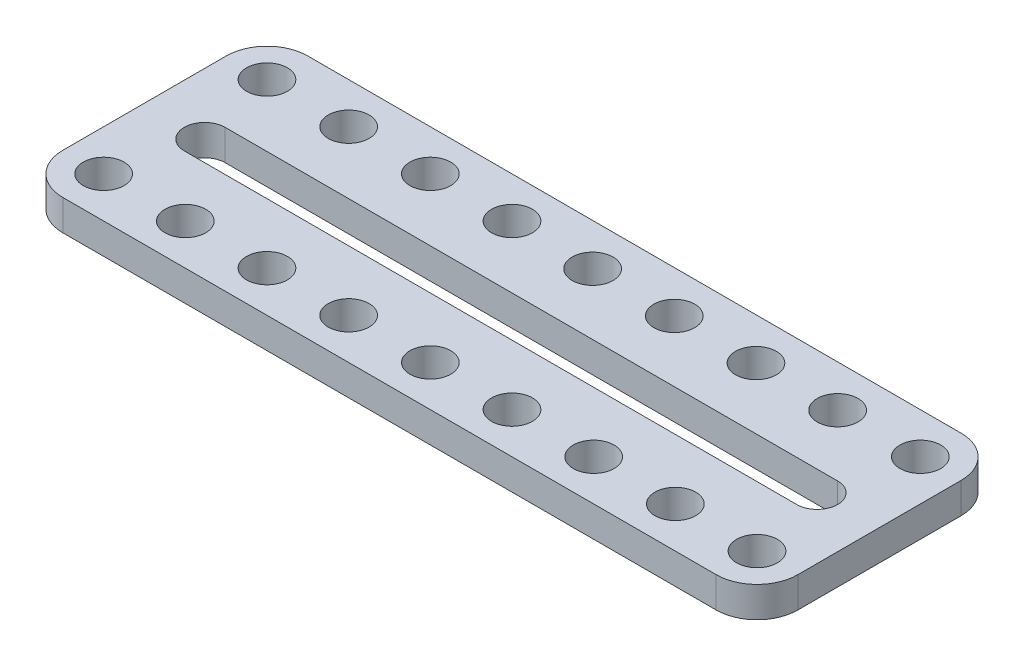
ISO-10303-21;
HEADER;
FILE_DESCRIPTION(('STEP AP214'),'2;1');
FILE_NAME('part.step','',(''),(''),'','','');
FILE_SCHEMA(('AUTOMOTIVE_DESIGN { 1 0 10303 214 1 1 1 1 }'));
ENDSEC;
DATA;
#1=APPLICATION_CONTEXT('core data for automotive mechanical design processes');
#2=APPLICATION_PROTOCOL_DEFINITION('international standard','automotive_design',2000,#1);
#3=PRODUCT_CONTEXT('',#1,'mechanical');
#4=PRODUCT('Part','Part','',(#3));
#5=PRODUCT_RELATED_PRODUCT_CATEGORY('part','',(#4));
#6=PRODUCT_DEFINITION_FORMATION('','',#4);
#7=PRODUCT_DEFINITION_CONTEXT('part definition',#1,'design');
#8=PRODUCT_DEFINITION('design','',#6,#7);
#9=PRODUCT_DEFINITION_SHAPE('','',#8);
#10=(LENGTH_UNIT() NAMED_UNIT(*) SI_UNIT(.MILLI.,.METRE.));
#11=(NAMED_UNIT(*) PLANE_ANGLE_UNIT() SI_UNIT($,.RADIAN.));
#12=(NAMED_UNIT(*) SI_UNIT($,.STERADIAN.) SOLID_ANGLE_UNIT());
#13=UNCERTAINTY_MEASURE_WITH_UNIT(LENGTH_MEASURE(1.E-05),#10,'distance_accuracy_value','');
#14=(GEOMETRIC_REPRESENTATION_CONTEXT(3) GLOBAL_UNCERTAINTY_ASSIGNED_CONTEXT((#13)) GLOBAL_UNIT_ASSIGNED_CONTEXT((#10,
#11,#12)) REPRESENTATION_CONTEXT('',''));
#15=CARTESIAN_POINT('',(0.,0.,0.));
#16=DIRECTION('',(0.,0.,1.));
#17=DIRECTION('',(1.,0.,0.));
#18=AXIS2_PLACEMENT_3D('',#15,#16,#17);
#19=CARTESIAN_POINT('',(12.2476042663866,3.,20.8795634586082));
#20=DIRECTION('',(0.,-1.,0.));
#21=DIRECTION('',(0.,0.,-1.));
#22=AXIS2_PLACEMENT_3D('',#19,#20,#21);
#23=CYLINDRICAL_SURFACE('',#22,4.);
#24=CARTESIAN_POINT('',(12.2476042663866,0.,20.8795634586082));
#25=DIRECTION('',(0.,1.,0.));
#26=DIRECTION('',(0.,0.,1.));
#27=AXIS2_PLACEMENT_3D('',#24,#25,#26);
#28=CIRCLE('',#27,4.);
#29=CARTESIAN_POINT('',(12.2476042663866,0.,24.8795634586082));
#30=VERTEX_POINT('',#29);
#31=CARTESIAN_POINT('',(16.2476042663866,0.,20.8795634586082));
#32=VERTEX_POINT('',#31);
#33=EDGE_CURVE('E271',#30,#32,#28,.T.);
#34=ORIENTED_EDGE('',*,*,#33,.T.);
#35=DIRECTION('',(0.,-1.,0.));
#36=VECTOR('',#35,1.);
#37=CARTESIAN_POINT('',(16.2476042663866,3.,20.8795634586082));
#38=LINE('',#37,#36);
#39=CARTESIAN_POINT('',(16.2476042663866,3.,20.8795634586082));
#40=VERTEX_POINT('',#39);
#41=EDGE_CURVE('E11',#40,#32,#38,.T.);
#42=ORIENTED_EDGE('',*,*,#41,.F.);
#43=CARTESIAN_POINT('',(12.2476042663866,3.,20.8795634586082));
#44=DIRECTION('',(0.,1.,0.));
#45=DIRECTION('',(0.,0.,1.));
#46=AXIS2_PLACEMENT_3D('',#43,#44,#45);
#47=CIRCLE('',#46,4.);
#48=CARTESIAN_POINT('',(12.2476042663866,3.,24.8795634586082));
#49=VERTEX_POINT('',#48);
#50=EDGE_CURVE('E272',#49,#40,#47,.T.);
#51=ORIENTED_EDGE('',*,*,#50,.F.);
#52=DIRECTION('',(0.,-1.,0.));
#53=VECTOR('',#52,1.);
#54=CARTESIAN_POINT('',(12.2476042663866,3.,24.8795634586082));
#55=LINE('',#54,#53);
#56=EDGE_CURVE('E290',#49,#30,#55,.T.);
#57=ORIENTED_EDGE('',*,*,#56,.T.);
#58=EDGE_LOOP('',(#34,#42,#51,#57));
#59=FACE_BOUND('',#58,.T.);
#60=ADVANCED_FACE('F38',(#59),#23,.T.);
#61=CARTESIAN_POINT('',(16.2476042663866,3.,20.8795634586082));
#62=DIRECTION('',(-1.,0.,0.));
#63=DIRECTION('',(0.,0.,1.));
#64=AXIS2_PLACEMENT_3D('',#61,#62,#63);
#65=PLANE('',#64);
#66=DIRECTION('',(0.,0.,-1.));
#67=VECTOR('',#66,1.);
#68=CARTESIAN_POINT('',(16.2476042663866,0.,20.8795634586082));
#69=LINE('',#68,#67);
#70=CARTESIAN_POINT('',(16.2476042663866,0.,4.87956345860823));
#71=VERTEX_POINT('',#70);
#72=EDGE_CURVE('E293',#32,#71,#69,.T.);
#73=ORIENTED_EDGE('',*,*,#72,.T.);
#74=DIRECTION('',(0.,-1.,0.));
#75=VECTOR('',#74,1.);
#76=CARTESIAN_POINT('',(16.2476042663866,3.,4.87956345860823));
#77=LINE('',#76,#75);
#78=CARTESIAN_POINT('',(16.2476042663866,3.,4.87956345860823));
#79=VERTEX_POINT('',#78);
#80=EDGE_CURVE('E45',#79,#71,#77,.T.);
#81=ORIENTED_EDGE('',*,*,#80,.F.);
#82=DIRECTION('',(0.,0.,-1.));
#83=VECTOR('',#82,1.);
#84=CARTESIAN_POINT('',(16.2476042663866,3.,20.8795634586082));
#85=LINE('',#84,#83);
#86=EDGE_CURVE('E275',#40,#79,#85,.T.);
#87=ORIENTED_EDGE('',*,*,#86,.F.);
#88=ORIENTED_EDGE('',*,*,#41,.T.);
#89=EDGE_LOOP('',(#73,#81,#87,#88));
#90=FACE_BOUND('',#89,.T.);
#91=ADVANCED_FACE('F349',(#90),#65,.F.);
#92=CARTESIAN_POINT('',(12.2476042663866,3.,4.8795634586082));
#93=DIRECTION('',(0.,-1.,0.));
#94=DIRECTION('',(0.,0.,-1.));
#95=AXIS2_PLACEMENT_3D('',#92,#93,#94);
#96=CYLINDRICAL_SURFACE('',#95,4.);
#97=CARTESIAN_POINT('',(12.2476042663866,0.,4.8795634586082));
#98=DIRECTION('',(0.,1.,0.));
#99=DIRECTION('',(0.,0.,1.));
#100=AXIS2_PLACEMENT_3D('',#97,#98,#99);
#101=CIRCLE('',#100,4.);
#102=CARTESIAN_POINT('',(12.2476042663866,0.,0.8795634586082));
#103=VERTEX_POINT('',#102);
#104=EDGE_CURVE('E295',#71,#103,#101,.T.);
#105=ORIENTED_EDGE('',*,*,#104,.T.);
#106=DIRECTION('',(0.,-1.,0.));
#107=VECTOR('',#106,1.);
#108=CARTESIAN_POINT('',(12.2476042663866,3.,0.8795634586082));
#109=LINE('',#108,#107);
#110=CARTESIAN_POINT('',(12.2476042663866,3.,0.8795634586082));
#111=VERTEX_POINT('',#110);
#112=EDGE_CURVE('E320',#111,#103,#109,.T.);
#113=ORIENTED_EDGE('',*,*,#112,.F.);
#114=CARTESIAN_POINT('',(12.2476042663866,3.,4.8795634586082));
#115=DIRECTION('',(0.,1.,0.));
#116=DIRECTION('',(0.,0.,1.));
#117=AXIS2_PLACEMENT_3D('',#114,#115,#116);
#118=CIRCLE('',#117,4.);
#119=EDGE_CURVE('E278',#79,#111,#118,.T.);
#120=ORIENTED_EDGE('',*,*,#119,.F.);
#121=ORIENTED_EDGE('',*,*,#80,.T.);
#122=EDGE_LOOP('',(#105,#113,#120,#121));
#123=FACE_BOUND('',#122,.T.);
#124=ADVANCED_FACE('F327',(#123),#96,.T.);
#125=CARTESIAN_POINT('',(12.2476042663866,3.,0.8795634586082));
#126=DIRECTION('',(0.,0.,1.));
#127=DIRECTION('',(1.,0.,0.));
#128=AXIS2_PLACEMENT_3D('',#125,#126,#127);
#129=PLANE('',#128);
#130=DIRECTION('',(-1.,0.,0.));
#131=VECTOR('',#130,1.);
#132=CARTESIAN_POINT('',(12.2476042663866,0.,0.8795634586082));
#133=LINE('',#132,#131);
#134=CARTESIAN_POINT('',(-51.7523957336134,0.,0.879563458608201));
#135=VERTEX_POINT('',#134);
#136=EDGE_CURVE('E297',#103,#135,#133,.T.);
#137=ORIENTED_EDGE('',*,*,#136,.T.);
#138=DIRECTION('',(0.,-1.,0.));
#139=VECTOR('',#138,1.);
#140=CARTESIAN_POINT('',(-51.7523957336134,3.,0.879563458608201));
#141=LINE('',#140,#139);
#142=CARTESIAN_POINT('',(-51.7523957336134,3.,0.879563458608201));
#143=VERTEX_POINT('',#142);
#144=EDGE_CURVE('E317',#143,#135,#141,.T.);
#145=ORIENTED_EDGE('',*,*,#144,.F.);
#146=DIRECTION('',(-1.,0.,0.));
#147=VECTOR('',#146,1.);
#148=CARTESIAN_POINT('',(12.2476042663866,3.,0.8795634586082));
#149=LINE('',#148,#147);
#150=EDGE_CURVE('E280',#111,#143,#149,.T.);
#151=ORIENTED_EDGE('',*,*,#150,.F.);
#152=ORIENTED_EDGE('',*,*,#112,.T.);
#153=EDGE_LOOP('',(#137,#145,#151,#152));
#154=FACE_BOUND('',#153,.T.);
#155=ADVANCED_FACE('F337',(#154),#129,.F.);
#156=CARTESIAN_POINT('',(-51.7523957336134,3.,4.8795634586082));
#157=DIRECTION('',(0.,-1.,0.));
#158=DIRECTION('',(0.,0.,-1.));
#159=AXIS2_PLACEMENT_3D('',#156,#157,#158);
#160=CYLINDRICAL_SURFACE('',#159,4.);
#161=CARTESIAN_POINT('',(-51.7523957336134,0.,4.8795634586082));
#162=DIRECTION('',(0.,1.,0.));
#163=DIRECTION('',(0.,0.,-1.));
#164=AXIS2_PLACEMENT_3D('',#161,#162,#163);
#165=CIRCLE('',#164,4.);
#166=CARTESIAN_POINT('',(-55.7523957336134,0.,4.87956345860823));
#167=VERTEX_POINT('',#166);
#168=EDGE_CURVE('E299',#135,#167,#165,.T.);
#169=ORIENTED_EDGE('',*,*,#168,.T.);
#170=DIRECTION('',(0.,-1.,0.));
#171=VECTOR('',#170,1.);
#172=CARTESIAN_POINT('',(-55.7523957336134,3.,4.87956345860823));
#173=LINE('',#172,#171);
#174=CARTESIAN_POINT('',(-55.7523957336134,3.,4.87956345860823));
#175=VERTEX_POINT('',#174);
#176=EDGE_CURVE('E314',#175,#167,#173,.T.);
#177=ORIENTED_EDGE('',*,*,#176,.F.);
#178=CARTESIAN_POINT('',(-51.7523957336134,3.,4.8795634586082));
#179=DIRECTION('',(0.,1.,0.));
#180=DIRECTION('',(0.,0.,-1.));
#181=AXIS2_PLACEMENT_3D('',#178,#179,#180);
#182=CIRCLE('',#181,4.);
#183=EDGE_CURVE('E282',#143,#175,#182,.T.);
#184=ORIENTED_EDGE('',*,*,#183,.F.);
#185=ORIENTED_EDGE('',*,*,#144,.T.);
#186=EDGE_LOOP('',(#169,#177,#184,#185));
#187=FACE_BOUND('',#186,.T.);
#188=ADVANCED_FACE('F341',(#187),#160,.T.);
#189=CARTESIAN_POINT('',(-55.7523957336134,3.,4.87956345860823));
#190=DIRECTION('',(1.,0.,0.));
#191=DIRECTION('',(0.,0.,-1.));
#192=AXIS2_PLACEMENT_3D('',#189,#190,#191);
#193=PLANE('',#192);
#194=DIRECTION('',(0.,0.,1.));
#195=VECTOR('',#194,1.);
#196=CARTESIAN_POINT('',(-55.7523957336134,0.,4.87956345860823));
#197=LINE('',#196,#195);
#198=CARTESIAN_POINT('',(-55.7523957336134,0.,20.8795634586082));
#199=VERTEX_POINT('',#198);
#200=EDGE_CURVE('E301',#167,#199,#197,.T.);
#201=ORIENTED_EDGE('',*,*,#200,.T.);
#202=DIRECTION('',(0.,-1.,0.));
#203=VECTOR('',#202,1.);
#204=CARTESIAN_POINT('',(-55.7523957336134,3.,20.8795634586082));
#205=LINE('',#204,#203);
#206=CARTESIAN_POINT('',(-55.7523957336134,3.,20.8795634586082));
#207=VERTEX_POINT('',#206);
#208=EDGE_CURVE('E311',#207,#199,#205,.T.);
#209=ORIENTED_EDGE('',*,*,#208,.F.);
#210=DIRECTION('',(0.,0.,1.));
#211=VECTOR('',#210,1.);
#212=CARTESIAN_POINT('',(-55.7523957336134,3.,4.87956345860823));
#213=LINE('',#212,#211);
#214=EDGE_CURVE('E284',#175,#207,#213,.T.);
#215=ORIENTED_EDGE('',*,*,#214,.F.);
#216=ORIENTED_EDGE('',*,*,#176,.T.);
#217=EDGE_LOOP('',(#201,#209,#215,#216));
#218=FACE_BOUND('',#217,.T.);
#219=ADVANCED_FACE('F362',(#218),#193,.F.);
#220=CARTESIAN_POINT('',(-51.7523957336134,3.,20.8795634586082));
#221=DIRECTION('',(0.,-1.,0.));
#222=DIRECTION('',(0.,0.,-1.));
#223=AXIS2_PLACEMENT_3D('',#220,#221,#222);
#224=CYLINDRICAL_SURFACE('',#223,4.);
#225=CARTESIAN_POINT('',(-51.7523957336134,0.,20.8795634586082));
#226=DIRECTION('',(0.,1.,0.));
#227=DIRECTION('',(0.,0.,1.));
#228=AXIS2_PLACEMENT_3D('',#225,#226,#227);
#229=CIRCLE('',#228,4.);
#230=CARTESIAN_POINT('',(-51.7523957336133,0.,24.8795634586082));
#231=VERTEX_POINT('',#230);
#232=EDGE_CURVE('E303',#199,#231,#229,.T.);
#233=ORIENTED_EDGE('',*,*,#232,.T.);
#234=DIRECTION('',(0.,-1.,0.));
#235=VECTOR('',#234,1.);
#236=CARTESIAN_POINT('',(-51.7523957336133,3.,24.8795634586082));
#237=LINE('',#236,#235);
#238=CARTESIAN_POINT('',(-51.7523957336133,3.,24.8795634586082));
#239=VERTEX_POINT('',#238);
#240=EDGE_CURVE('E308',#239,#231,#237,.T.);
#241=ORIENTED_EDGE('',*,*,#240,.F.);
#242=CARTESIAN_POINT('',(-51.7523957336134,3.,20.8795634586082));
#243=DIRECTION('',(0.,1.,0.));
#244=DIRECTION('',(0.,0.,1.));
#245=AXIS2_PLACEMENT_3D('',#242,#243,#244);
#246=CIRCLE('',#245,4.);
#247=EDGE_CURVE('E286',#207,#239,#246,.T.);
#248=ORIENTED_EDGE('',*,*,#247,.F.);
#249=ORIENTED_EDGE('',*,*,#208,.T.);
#250=EDGE_LOOP('',(#233,#241,#248,#249));
#251=FACE_BOUND('',#250,.T.);
#252=ADVANCED_FACE('F360',(#251),#224,.T.);
#253=CARTESIAN_POINT('',(-51.7523957336133,3.,24.8795634586082));
#254=DIRECTION('',(0.,0.,-1.));
#255=DIRECTION('',(-1.,0.,0.));
#256=AXIS2_PLACEMENT_3D('',#253,#254,#255);
#257=PLANE('',#256);
#258=DIRECTION('',(1.,0.,0.));
#259=VECTOR('',#258,1.);
#260=CARTESIAN_POINT('',(-51.7523957336133,0.,24.8795634586082));
#261=LINE('',#260,#259);
#262=EDGE_CURVE('E276',#231,#30,#261,.T.);
#263=ORIENTED_EDGE('',*,*,#262,.T.);
#264=ORIENTED_EDGE('',*,*,#56,.F.);
#265=DIRECTION('',(1.,0.,0.));
#266=VECTOR('',#265,1.);
#267=CARTESIAN_POINT('',(-51.7523957336133,3.,24.8795634586082));
#268=LINE('',#267,#266);
#269=EDGE_CURVE('E288',#239,#49,#268,.T.);
#270=ORIENTED_EDGE('',*,*,#269,.F.);
#271=ORIENTED_EDGE('',*,*,#240,.T.);
#272=EDGE_LOOP('',(#263,#264,#270,#271));
#273=FACE_BOUND('',#272,.T.);
#274=ADVANCED_FACE('F355',(#273),#257,.F.);
#275=CARTESIAN_POINT('',(12.2476042663866,3.,20.8795634586082));
#276=DIRECTION('',(0.,1.,0.));
#277=DIRECTION('',(0.,0.,1.));
#278=AXIS2_PLACEMENT_3D('',#275,#276,#277);
#279=PLANE('',#278);
#280=CARTESIAN_POINT('',(-43.7523957336134,3.,4.8795634586082));
#281=DIRECTION('',(0.,1.,0.));
#282=DIRECTION('',(0.,0.,1.));
#283=AXIS2_PLACEMENT_3D('',#280,#281,#282);
#284=CIRCLE('',#283,2.);
#285=CARTESIAN_POINT('',(-43.7523957336134,3.,6.8795634586082));
#286=VERTEX_POINT('',#285);
#287=EDGE_CURVE('E268',#286,#286,#284,.F.);
#288=ORIENTED_EDGE('',*,*,#287,.T.);
#289=EDGE_LOOP('',(#288));
#290=FACE_BOUND('',#289,.T.);
#291=CARTESIAN_POINT('',(-35.7523957336134,3.,4.8795634586082));
#292=DIRECTION('',(0.,1.,0.));
#293=DIRECTION('',(0.,0.,1.));
#294=AXIS2_PLACEMENT_3D('',#291,#292,#293);
#295=CIRCLE('',#294,2.);
#296=CARTESIAN_POINT('',(-35.7523957336134,3.,6.8795634586082));
#297=VERTEX_POINT('',#296);
#298=EDGE_CURVE('E265',#297,#297,#295,.F.);
#299=ORIENTED_EDGE('',*,*,#298,.T.);
#300=EDGE_LOOP('',(#299));
#301=FACE_BOUND('',#300,.T.);
#302=CARTESIAN_POINT('',(-27.7523957336134,3.,4.8795634586082));
#303=DIRECTION('',(0.,1.,0.));
#304=DIRECTION('',(0.,0.,1.));
#305=AXIS2_PLACEMENT_3D('',#302,#303,#304);
#306=CIRCLE('',#305,2.);
#307=CARTESIAN_POINT('',(-27.7523957336134,3.,6.8795634586082));
#308=VERTEX_POINT('',#307);
#309=EDGE_CURVE('E262',#308,#308,#306,.F.);
#310=ORIENTED_EDGE('',*,*,#309,.T.);
#311=EDGE_LOOP('',(#310));
#312=FACE_BOUND('',#311,.T.);
#313=CARTESIAN_POINT('',(-19.7530607598001,3.,4.98271372146491));
#314=DIRECTION('',(0.,1.,0.));
#315=DIRECTION('',(0.,0.,1.));
#316=AXIS2_PLACEMENT_3D('',#313,#314,#315);
#317=CIRCLE('',#316,2.);
#318=CARTESIAN_POINT('',(-19.7530607598001,3.,6.98271372146492));
#319=VERTEX_POINT('',#318);
#320=EDGE_CURVE('E259',#319,#319,#317,.F.);
#321=ORIENTED_EDGE('',*,*,#320,.T.);
#322=EDGE_LOOP('',(#321));
#323=FACE_BOUND('',#322,.T.);
#324=CARTESIAN_POINT('',(-3.75306075980007,3.,4.98271372146488));
#325=DIRECTION('',(0.,1.,0.));
#326=DIRECTION('',(0.,0.,1.));
#327=AXIS2_PLACEMENT_3D('',#324,#325,#326);
#328=CIRCLE('',#327,2.);
#329=CARTESIAN_POINT('',(-3.75306075980007,3.,6.98271372146488));
#330=VERTEX_POINT('',#329);
#331=EDGE_CURVE('E256',#330,#330,#328,.F.);
#332=ORIENTED_EDGE('',*,*,#331,.T.);
#333=EDGE_LOOP('',(#332));
#334=FACE_BOUND('',#333,.T.);
#335=CARTESIAN_POINT('',(-11.7530607598001,3.,4.98271372146488));
#336=DIRECTION('',(0.,1.,0.));
#337=DIRECTION('',(0.,0.,1.));
#338=AXIS2_PLACEMENT_3D('',#335,#336,#337);
#339=CIRCLE('',#338,2.);
#340=CARTESIAN_POINT('',(-11.7530607598001,3.,6.98271372146488));
#341=VERTEX_POINT('',#340);
#342=EDGE_CURVE('E253',#341,#341,#339,.F.);
#343=ORIENTED_EDGE('',*,*,#342,.T.);
#344=EDGE_LOOP('',(#343));
#345=FACE_BOUND('',#344,.T.);
#346=CARTESIAN_POINT('',(4.24693924019993,3.,4.98271372146488));
#347=DIRECTION('',(0.,1.,0.));
#348=DIRECTION('',(0.,0.,1.));
#349=AXIS2_PLACEMENT_3D('',#346,#347,#348);
#350=CIRCLE('',#349,2.);
#351=CARTESIAN_POINT('',(4.24693924019993,3.,6.98271372146488));
#352=VERTEX_POINT('',#351);
#353=EDGE_CURVE('E250',#352,#352,#350,.F.);
#354=ORIENTED_EDGE('',*,*,#353,.T.);
#355=EDGE_LOOP('',(#354));
#356=FACE_BOUND('',#355,.T.);
#357=CARTESIAN_POINT('',(12.2476042663866,3.,4.8795634586082));
#358=DIRECTION('',(0.,1.,0.));
#359=DIRECTION('',(0.,0.,1.));
#360=AXIS2_PLACEMENT_3D('',#357,#358,#359);
#361=CIRCLE('',#360,2.);
#362=CARTESIAN_POINT('',(12.2476042663866,3.,6.8795634586082));
#363=VERTEX_POINT('',#362);
#364=EDGE_CURVE('E247',#363,#363,#361,.F.);
#365=ORIENTED_EDGE('',*,*,#364,.T.);
#366=EDGE_LOOP('',(#365));
#367=FACE_BOUND('',#366,.T.);
#368=CARTESIAN_POINT('',(-51.7523957336134,3.,20.8795634586082));
#369=DIRECTION('',(0.,1.,0.));
#370=DIRECTION('',(0.,0.,1.));
#371=AXIS2_PLACEMENT_3D('',#368,#369,#370);
#372=CIRCLE('',#371,2.);
#373=CARTESIAN_POINT('',(-51.7523957336134,3.,22.8795634586082));
#374=VERTEX_POINT('',#373);
#375=EDGE_CURVE('E244',#374,#374,#372,.F.);
#376=ORIENTED_EDGE('',*,*,#375,.T.);
#377=EDGE_LOOP('',(#376));
#378=FACE_BOUND('',#377,.T.);
#379=CARTESIAN_POINT('',(-43.7523957336134,3.,20.8795634586082));
#380=DIRECTION('',(0.,1.,0.));
#381=DIRECTION('',(0.,0.,1.));
#382=AXIS2_PLACEMENT_3D('',#379,#380,#381);
#383=CIRCLE('',#382,2.);
#384=CARTESIAN_POINT('',(-43.7523957336134,3.,22.8795634586082));
#385=VERTEX_POINT('',#384);
#386=EDGE_CURVE('E241',#385,#385,#383,.F.);
#387=ORIENTED_EDGE('',*,*,#386,.T.);
#388=EDGE_LOOP('',(#387));
#389=FACE_BOUND('',#388,.T.);
#390=CARTESIAN_POINT('',(-35.7523957336134,3.,20.8795634586082));
#391=DIRECTION('',(0.,1.,0.));
#392=DIRECTION('',(0.,0.,1.));
#393=AXIS2_PLACEMENT_3D('',#390,#391,#392);
#394=CIRCLE('',#393,2.);
#395=CARTESIAN_POINT('',(-35.7523957336134,3.,22.8795634586082));
#396=VERTEX_POINT('',#395);
#397=EDGE_CURVE('E238',#396,#396,#394,.F.);
#398=ORIENTED_EDGE('',*,*,#397,.T.);
#399=EDGE_LOOP('',(#398));
#400=FACE_BOUND('',#399,.T.);
#401=CARTESIAN_POINT('',(-27.7523957336134,3.,20.8795634586082));
#402=DIRECTION('',(0.,1.,0.));
#403=DIRECTION('',(0.,0.,1.));
#404=AXIS2_PLACEMENT_3D('',#401,#402,#403);
#405=CIRCLE('',#404,2.);
#406=CARTESIAN_POINT('',(-27.7523957336134,3.,22.8795634586082));
#407=VERTEX_POINT('',#406);
#408=EDGE_CURVE('E235',#407,#407,#405,.F.);
#409=ORIENTED_EDGE('',*,*,#408,.T.);
#410=EDGE_LOOP('',(#409));
#411=FACE_BOUND('',#410,.T.);
#412=CARTESIAN_POINT('',(-19.7523957336134,3.,20.8795634586082));
#413=DIRECTION('',(0.,1.,0.));
#414=DIRECTION('',(0.,0.,1.));
#415=AXIS2_PLACEMENT_3D('',#412,#413,#414);
#416=CIRCLE('',#415,2.);
#417=CARTESIAN_POINT('',(-19.7523957336134,3.,22.8795634586082));
#418=VERTEX_POINT('',#417);
#419=EDGE_CURVE('E232',#418,#418,#416,.F.);
#420=ORIENTED_EDGE('',*,*,#419,.T.);
#421=EDGE_LOOP('',(#420));
#422=FACE_BOUND('',#421,.T.);
#423=CARTESIAN_POINT('',(-11.7523957336134,3.,20.8795634586082));
#424=DIRECTION('',(0.,1.,0.));
#425=DIRECTION('',(0.,0.,1.));
#426=AXIS2_PLACEMENT_3D('',#423,#424,#425);
#427=CIRCLE('',#426,2.);
#428=CARTESIAN_POINT('',(-11.7523957336134,3.,22.8795634586082));
#429=VERTEX_POINT('',#428);
#430=EDGE_CURVE('E229',#429,#429,#427,.F.);
#431=ORIENTED_EDGE('',*,*,#430,.T.);
#432=EDGE_LOOP('',(#431));
#433=FACE_BOUND('',#432,.T.);
#434=CARTESIAN_POINT('',(-3.75239573361337,3.,20.8795634586082));
#435=DIRECTION('',(0.,1.,0.));
#436=DIRECTION('',(0.,0.,1.));
#437=AXIS2_PLACEMENT_3D('',#434,#435,#436);
#438=CIRCLE('',#437,2.);
#439=CARTESIAN_POINT('',(-3.75239573361337,3.,22.8795634586082));
#440=VERTEX_POINT('',#439);
#441=EDGE_CURVE('E226',#440,#440,#438,.F.);
#442=ORIENTED_EDGE('',*,*,#441,.T.);
#443=EDGE_LOOP('',(#442));
#444=FACE_BOUND('',#443,.T.);
#445=CARTESIAN_POINT('',(4.24760426638663,3.,20.8795634586082));
#446=DIRECTION('',(0.,1.,0.));
#447=DIRECTION('',(0.,0.,1.));
#448=AXIS2_PLACEMENT_3D('',#445,#446,#447);
#449=CIRCLE('',#448,2.);
#450=CARTESIAN_POINT('',(4.24760426638663,3.,22.8795634586082));
#451=VERTEX_POINT('',#450);
#452=EDGE_CURVE('E223',#451,#451,#449,.F.);
#453=ORIENTED_EDGE('',*,*,#452,.T.);
#454=EDGE_LOOP('',(#453));
#455=FACE_BOUND('',#454,.T.);
#456=CARTESIAN_POINT('',(12.2476042663866,3.,20.8795634586082));
#457=DIRECTION('',(0.,1.,0.));
#458=DIRECTION('',(0.,0.,1.));
#459=AXIS2_PLACEMENT_3D('',#456,#457,#458);
#460=CIRCLE('',#459,2.);
#461=CARTESIAN_POINT('',(12.2476042663866,3.,22.8795634586082));
#462=VERTEX_POINT('',#461);
#463=EDGE_CURVE('E220',#462,#462,#460,.F.);
#464=ORIENTED_EDGE('',*,*,#463,.T.);
#465=EDGE_LOOP('',(#464));
#466=FACE_BOUND('',#465,.T.);
#467=DIRECTION('',(1.,0.,0.));
#468=VECTOR('',#467,1.);
#469=CARTESIAN_POINT('',(12.2476042663866,3.,10.9827137214649));
#470=LINE('',#469,#468);
#471=CARTESIAN_POINT('',(-49.7523957336134,3.,10.982713721465));
#472=VERTEX_POINT('',#471);
#473=CARTESIAN_POINT('',(10.2476042663866,3.,10.9827137214649));
#474=VERTEX_POINT('',#473);
#475=EDGE_CURVE('E217',#472,#474,#470,.T.);
#476=ORIENTED_EDGE('',*,*,#475,.T.);
#477=CARTESIAN_POINT('',(10.2476042663866,3.,12.9827137214649));
#478=DIRECTION('',(0.,1.,0.));
#479=DIRECTION('',(0.,0.,1.));
#480=AXIS2_PLACEMENT_3D('',#477,#478,#479);
#481=CIRCLE('',#480,2.);
#482=CARTESIAN_POINT('',(10.2476042663866,3.,14.9827137214649));
#483=VERTEX_POINT('',#482);
#484=EDGE_CURVE('E129',#474,#483,#481,.F.);
#485=ORIENTED_EDGE('',*,*,#484,.T.);
#486=DIRECTION('',(-1.,0.,0.));
#487=VECTOR('',#486,1.);
#488=CARTESIAN_POINT('',(12.2476042663866,3.,14.9827137214649));
#489=LINE('',#488,#487);
#490=CARTESIAN_POINT('',(-49.7523957336134,3.,14.982713721465));
#491=VERTEX_POINT('',#490);
#492=EDGE_CURVE('E211',#483,#491,#489,.T.);
#493=ORIENTED_EDGE('',*,*,#492,.T.);
#494=CARTESIAN_POINT('',(-49.7523957336134,3.,12.982713721465));
#495=DIRECTION('',(0.,1.,0.));
#496=DIRECTION('',(0.,0.,1.));
#497=AXIS2_PLACEMENT_3D('',#494,#495,#496);
#498=CIRCLE('',#497,2.);
#499=EDGE_CURVE('E214',#491,#472,#498,.F.);
#500=ORIENTED_EDGE('',*,*,#499,.T.);
#501=EDGE_LOOP('',(#476,#485,#493,#500));
#502=FACE_BOUND('',#501,.T.);
#503=CARTESIAN_POINT('',(-51.7523957336134,3.,4.8795634586082));
#504=DIRECTION('',(0.,1.,0.));
#505=DIRECTION('',(0.,0.,1.));
#506=AXIS2_PLACEMENT_3D('',#503,#504,#505);
#507=CIRCLE('',#506,2.);
#508=CARTESIAN_POINT('',(-51.7523957336134,3.,6.8795634586082));
#509=VERTEX_POINT('',#508);
#510=EDGE_CURVE('E208',#509,#509,#507,.F.);
#511=ORIENTED_EDGE('',*,*,#510,.T.);
#512=EDGE_LOOP('',(#511));
#513=FACE_BOUND('',#512,.T.);
#514=ORIENTED_EDGE('',*,*,#50,.T.);
#515=ORIENTED_EDGE('',*,*,#86,.T.);
#516=ORIENTED_EDGE('',*,*,#119,.T.);
#517=ORIENTED_EDGE('',*,*,#150,.T.);
#518=ORIENTED_EDGE('',*,*,#183,.T.);
#519=ORIENTED_EDGE('',*,*,#214,.T.);
#520=ORIENTED_EDGE('',*,*,#247,.T.);
#521=ORIENTED_EDGE('',*,*,#269,.T.);
#522=EDGE_LOOP('',(#514,#515,#516,#517,#518,#519,#520,#521));
#523=FACE_BOUND('',#522,.T.);
#524=ADVANCED_FACE('F345',(#290,#301,#312,#323,#334,#345,#356,#367,#378,#389,#400,#411,#422,
#433,#444,#455,#466,#502,#513,#523),#279,.T.);
#525=CARTESIAN_POINT('',(12.2476042663866,0.,20.8795634586082));
#526=DIRECTION('',(0.,1.,0.));
#527=DIRECTION('',(0.,0.,1.));
#528=AXIS2_PLACEMENT_3D('',#525,#526,#527);
#529=PLANE('',#528);
#530=CARTESIAN_POINT('',(-43.7523957336134,0.,4.8795634586082));
#531=DIRECTION('',(0.,1.,0.));
#532=DIRECTION('',(0.,0.,1.));
#533=AXIS2_PLACEMENT_3D('',#530,#531,#532);
#534=CIRCLE('',#533,2.);
#535=CARTESIAN_POINT('',(-43.7523957336134,0.,6.8795634586082));
#536=VERTEX_POINT('',#535);
#537=EDGE_CURVE('E157',#536,#536,#534,.T.);
#538=ORIENTED_EDGE('',*,*,#537,.T.);
#539=EDGE_LOOP('',(#538));
#540=FACE_BOUND('',#539,.T.);
#541=CARTESIAN_POINT('',(-35.7523957336134,0.,4.8795634586082));
#542=DIRECTION('',(0.,1.,0.));
#543=DIRECTION('',(0.,0.,1.));
#544=AXIS2_PLACEMENT_3D('',#541,#542,#543);
#545=CIRCLE('',#544,2.);
#546=CARTESIAN_POINT('',(-35.7523957336134,0.,6.8795634586082));
#547=VERTEX_POINT('',#546);
#548=EDGE_CURVE('E161',#547,#547,#545,.T.);
#549=ORIENTED_EDGE('',*,*,#548,.T.);
#550=EDGE_LOOP('',(#549));
#551=FACE_BOUND('',#550,.T.);
#552=CARTESIAN_POINT('',(-27.7523957336134,0.,4.8795634586082));
#553=DIRECTION('',(0.,1.,0.));
#554=DIRECTION('',(0.,0.,1.));
#555=AXIS2_PLACEMENT_3D('',#552,#553,#554);
#556=CIRCLE('',#555,2.);
#557=CARTESIAN_POINT('',(-27.7523957336134,0.,6.8795634586082));
#558=VERTEX_POINT('',#557);
#559=EDGE_CURVE('E164',#558,#558,#556,.T.);
#560=ORIENTED_EDGE('',*,*,#559,.T.);
#561=EDGE_LOOP('',(#560));
#562=FACE_BOUND('',#561,.T.);
#563=CARTESIAN_POINT('',(-19.7530607598001,0.,4.98271372146491));
#564=DIRECTION('',(0.,1.,0.));
#565=DIRECTION('',(0.,0.,1.));
#566=AXIS2_PLACEMENT_3D('',#563,#564,#565);
#567=CIRCLE('',#566,2.);
#568=CARTESIAN_POINT('',(-19.7530607598001,0.,6.98271372146492));
#569=VERTEX_POINT('',#568);
#570=EDGE_CURVE('E167',#569,#569,#567,.T.);
#571=ORIENTED_EDGE('',*,*,#570,.T.);
#572=EDGE_LOOP('',(#571));
#573=FACE_BOUND('',#572,.T.);
#574=CARTESIAN_POINT('',(-3.75306075980007,0.,4.98271372146488));
#575=DIRECTION('',(0.,1.,0.));
#576=DIRECTION('',(0.,0.,1.));
#577=AXIS2_PLACEMENT_3D('',#574,#575,#576);
#578=CIRCLE('',#577,2.);
#579=CARTESIAN_POINT('',(-3.75306075980007,0.,6.98271372146488));
#580=VERTEX_POINT('',#579);
#581=EDGE_CURVE('E170',#580,#580,#578,.T.);
#582=ORIENTED_EDGE('',*,*,#581,.T.);
#583=EDGE_LOOP('',(#582));
#584=FACE_BOUND('',#583,.T.);
#585=CARTESIAN_POINT('',(-11.7530607598001,0.,4.98271372146488));
#586=DIRECTION('',(0.,1.,0.));
#587=DIRECTION('',(0.,0.,1.));
#588=AXIS2_PLACEMENT_3D('',#585,#586,#587);
#589=CIRCLE('',#588,2.);
#590=CARTESIAN_POINT('',(-11.7530607598001,0.,6.98271372146488));
#591=VERTEX_POINT('',#590);
#592=EDGE_CURVE('E173',#591,#591,#589,.T.);
#593=ORIENTED_EDGE('',*,*,#592,.T.);
#594=EDGE_LOOP('',(#593));
#595=FACE_BOUND('',#594,.T.);
#596=CARTESIAN_POINT('',(4.24693924019993,0.,4.98271372146488));
#597=DIRECTION('',(0.,1.,0.));
#598=DIRECTION('',(0.,0.,1.));
#599=AXIS2_PLACEMENT_3D('',#596,#597,#598);
#600=CIRCLE('',#599,2.);
#601=CARTESIAN_POINT('',(4.24693924019993,0.,6.98271372146488));
#602=VERTEX_POINT('',#601);
#603=EDGE_CURVE('E176',#602,#602,#600,.T.);
#604=ORIENTED_EDGE('',*,*,#603,.T.);
#605=EDGE_LOOP('',(#604));
#606=FACE_BOUND('',#605,.T.);
#607=CARTESIAN_POINT('',(12.2476042663866,0.,4.8795634586082));
#608=DIRECTION('',(0.,1.,0.));
#609=DIRECTION('',(0.,0.,1.));
#610=AXIS2_PLACEMENT_3D('',#607,#608,#609);
#611=CIRCLE('',#610,2.);
#612=CARTESIAN_POINT('',(12.2476042663866,0.,6.8795634586082));
#613=VERTEX_POINT('',#612);
#614=EDGE_CURVE('E179',#613,#613,#611,.T.);
#615=ORIENTED_EDGE('',*,*,#614,.T.);
#616=EDGE_LOOP('',(#615));
#617=FACE_BOUND('',#616,.T.);
#618=CARTESIAN_POINT('',(-51.7523957336134,0.,20.8795634586082));
#619=DIRECTION('',(0.,1.,0.));
#620=DIRECTION('',(0.,0.,1.));
#621=AXIS2_PLACEMENT_3D('',#618,#619,#620);
#622=CIRCLE('',#621,2.);
#623=CARTESIAN_POINT('',(-51.7523957336134,0.,22.8795634586082));
#624=VERTEX_POINT('',#623);
#625=EDGE_CURVE('E182',#624,#624,#622,.T.);
#626=ORIENTED_EDGE('',*,*,#625,.T.);
#627=EDGE_LOOP('',(#626));
#628=FACE_BOUND('',#627,.T.);
#629=CARTESIAN_POINT('',(-43.7523957336134,0.,20.8795634586082));
#630=DIRECTION('',(0.,1.,0.));
#631=DIRECTION('',(0.,0.,1.));
#632=AXIS2_PLACEMENT_3D('',#629,#630,#631);
#633=CIRCLE('',#632,2.);
#634=CARTESIAN_POINT('',(-43.7523957336134,0.,22.8795634586082));
#635=VERTEX_POINT('',#634);
#636=EDGE_CURVE('E185',#635,#635,#633,.T.);
#637=ORIENTED_EDGE('',*,*,#636,.T.);
#638=EDGE_LOOP('',(#637));
#639=FACE_BOUND('',#638,.T.);
#640=CARTESIAN_POINT('',(-35.7523957336134,0.,20.8795634586082));
#641=DIRECTION('',(0.,1.,0.));
#642=DIRECTION('',(0.,0.,1.));
#643=AXIS2_PLACEMENT_3D('',#640,#641,#642);
#644=CIRCLE('',#643,2.);
#645=CARTESIAN_POINT('',(-35.7523957336134,0.,22.8795634586082));
#646=VERTEX_POINT('',#645);
#647=EDGE_CURVE('E188',#646,#646,#644,.T.);
#648=ORIENTED_EDGE('',*,*,#647,.T.);
#649=EDGE_LOOP('',(#648));
#650=FACE_BOUND('',#649,.T.);
#651=CARTESIAN_POINT('',(-27.7523957336134,0.,20.8795634586082));
#652=DIRECTION('',(0.,1.,0.));
#653=DIRECTION('',(0.,0.,1.));
#654=AXIS2_PLACEMENT_3D('',#651,#652,#653);
#655=CIRCLE('',#654,2.);
#656=CARTESIAN_POINT('',(-27.7523957336134,0.,22.8795634586082));
#657=VERTEX_POINT('',#656);
#658=EDGE_CURVE('E191',#657,#657,#655,.T.);
#659=ORIENTED_EDGE('',*,*,#658,.T.);
#660=EDGE_LOOP('',(#659));
#661=FACE_BOUND('',#660,.T.);
#662=CARTESIAN_POINT('',(-19.7523957336134,0.,20.8795634586082));
#663=DIRECTION('',(0.,1.,0.));
#664=DIRECTION('',(0.,0.,1.));
#665=AXIS2_PLACEMENT_3D('',#662,#663,#664);
#666=CIRCLE('',#665,2.);
#667=CARTESIAN_POINT('',(-19.7523957336134,0.,22.8795634586082));
#668=VERTEX_POINT('',#667);
#669=EDGE_CURVE('E194',#668,#668,#666,.T.);
#670=ORIENTED_EDGE('',*,*,#669,.T.);
#671=EDGE_LOOP('',(#670));
#672=FACE_BOUND('',#671,.T.);
#673=CARTESIAN_POINT('',(-11.7523957336134,0.,20.8795634586082));
#674=DIRECTION('',(0.,1.,0.));
#675=DIRECTION('',(0.,0.,1.));
#676=AXIS2_PLACEMENT_3D('',#673,#674,#675);
#677=CIRCLE('',#676,2.);
#678=CARTESIAN_POINT('',(-11.7523957336134,0.,22.8795634586082));
#679=VERTEX_POINT('',#678);
#680=EDGE_CURVE('E197',#679,#679,#677,.T.);
#681=ORIENTED_EDGE('',*,*,#680,.T.);
#682=EDGE_LOOP('',(#681));
#683=FACE_BOUND('',#682,.T.);
#684=CARTESIAN_POINT('',(-3.75239573361337,0.,20.8795634586082));
#685=DIRECTION('',(0.,1.,0.));
#686=DIRECTION('',(0.,0.,1.));
#687=AXIS2_PLACEMENT_3D('',#684,#685,#686);
#688=CIRCLE('',#687,2.);
#689=CARTESIAN_POINT('',(-3.75239573361337,0.,22.8795634586082));
#690=VERTEX_POINT('',#689);
#691=EDGE_CURVE('E200',#690,#690,#688,.T.);
#692=ORIENTED_EDGE('',*,*,#691,.T.);
#693=EDGE_LOOP('',(#692));
#694=FACE_BOUND('',#693,.T.);
#695=CARTESIAN_POINT('',(4.24760426638663,0.,20.8795634586082));
#696=DIRECTION('',(0.,1.,0.));
#697=DIRECTION('',(0.,0.,1.));
#698=AXIS2_PLACEMENT_3D('',#695,#696,#697);
#699=CIRCLE('',#698,2.);
#700=CARTESIAN_POINT('',(4.24760426638663,0.,22.8795634586082));
#701=VERTEX_POINT('',#700);
#702=EDGE_CURVE('E203',#701,#701,#699,.T.);
#703=ORIENTED_EDGE('',*,*,#702,.T.);
#704=EDGE_LOOP('',(#703));
#705=FACE_BOUND('',#704,.T.);
#706=CARTESIAN_POINT('',(12.2476042663866,0.,20.8795634586082));
#707=DIRECTION('',(0.,1.,0.));
#708=DIRECTION('',(0.,0.,1.));
#709=AXIS2_PLACEMENT_3D('',#706,#707,#708);
#710=CIRCLE('',#709,2.);
#711=CARTESIAN_POINT('',(12.2476042663866,0.,22.8795634586082));
#712=VERTEX_POINT('',#711);
#713=EDGE_CURVE('E132',#712,#712,#710,.T.);
#714=ORIENTED_EDGE('',*,*,#713,.T.);
#715=EDGE_LOOP('',(#714));
#716=FACE_BOUND('',#715,.T.);
#717=CARTESIAN_POINT('',(10.2476042663866,0.,12.9827137214649));
#718=DIRECTION('',(0.,1.,0.));
#719=DIRECTION('',(0.,0.,1.));
#720=AXIS2_PLACEMENT_3D('',#717,#718,#719);
#721=CIRCLE('',#720,2.);
#722=CARTESIAN_POINT('',(10.2476042663866,0.,14.9827137214649));
#723=VERTEX_POINT('',#722);
#724=CARTESIAN_POINT('',(10.2476042663866,0.,10.9827137214649));
#725=VERTEX_POINT('',#724);
#726=EDGE_CURVE('E60',#723,#725,#721,.T.);
#727=ORIENTED_EDGE('',*,*,#726,.T.);
#728=DIRECTION('',(-1.,0.,0.));
#729=VECTOR('',#728,1.);
#730=CARTESIAN_POINT('',(10.2476042663866,0.,10.9827137214649));
#731=LINE('',#730,#729);
#732=CARTESIAN_POINT('',(-49.7523957336134,0.,10.982713721465));
#733=VERTEX_POINT('',#732);
#734=EDGE_CURVE('E136',#725,#733,#731,.T.);
#735=ORIENTED_EDGE('',*,*,#734,.T.);
#736=CARTESIAN_POINT('',(-49.7523957336134,0.,12.982713721465));
#737=DIRECTION('',(0.,1.,0.));
#738=DIRECTION('',(0.,0.,1.));
#739=AXIS2_PLACEMENT_3D('',#736,#737,#738);
#740=CIRCLE('',#739,2.);
#741=CARTESIAN_POINT('',(-49.7523957336134,0.,14.982713721465));
#742=VERTEX_POINT('',#741);
#743=EDGE_CURVE('E142',#733,#742,#740,.T.);
#744=ORIENTED_EDGE('',*,*,#743,.T.);
#745=DIRECTION('',(1.,0.,0.));
#746=VECTOR('',#745,1.);
#747=CARTESIAN_POINT('',(10.2476042663866,0.,14.9827137214649));
#748=LINE('',#747,#746);
#749=EDGE_CURVE('E147',#742,#723,#748,.T.);
#750=ORIENTED_EDGE('',*,*,#749,.T.);
#751=EDGE_LOOP('',(#727,#735,#744,#750));
#752=FACE_BOUND('',#751,.T.);
#753=CARTESIAN_POINT('',(-51.7523957336134,0.,4.8795634586082));
#754=DIRECTION('',(0.,1.,0.));
#755=DIRECTION('',(0.,0.,1.));
#756=AXIS2_PLACEMENT_3D('',#753,#754,#755);
#757=CIRCLE('',#756,2.);
#758=CARTESIAN_POINT('',(-51.7523957336134,0.,6.8795634586082));
#759=VERTEX_POINT('',#758);
#760=EDGE_CURVE('E160',#759,#759,#757,.T.);
#761=ORIENTED_EDGE('',*,*,#760,.T.);
#762=EDGE_LOOP('',(#761));
#763=FACE_BOUND('',#762,.T.);
#764=ORIENTED_EDGE('',*,*,#33,.F.);
#765=ORIENTED_EDGE('',*,*,#262,.F.);
#766=ORIENTED_EDGE('',*,*,#232,.F.);
#767=ORIENTED_EDGE('',*,*,#200,.F.);
#768=ORIENTED_EDGE('',*,*,#168,.F.);
#769=ORIENTED_EDGE('',*,*,#136,.F.);
#770=ORIENTED_EDGE('',*,*,#104,.F.);
#771=ORIENTED_EDGE('',*,*,#72,.F.);
#772=EDGE_LOOP('',(#764,#765,#766,#767,#768,#769,#770,#771));
#773=FACE_BOUND('',#772,.T.);
#774=ADVANCED_FACE('F145',(#540,#551,#562,#573,#584,#595,#606,#617,#628,#639,#650,#661,#672,
#683,#694,#705,#716,#752,#763,#773),#529,.F.);
#775=CARTESIAN_POINT('',(-51.7523957336134,11.,4.8795634586082));
#776=DIRECTION('',(0.,-1.,0.));
#777=DIRECTION('',(0.,0.,-1.));
#778=AXIS2_PLACEMENT_3D('',#775,#776,#777);
#779=CYLINDRICAL_SURFACE('',#778,2.);
#780=ORIENTED_EDGE('',*,*,#510,.F.);
#781=EDGE_LOOP('',(#780));
#782=FACE_BOUND('',#781,.T.);
#783=ORIENTED_EDGE('',*,*,#760,.F.);
#784=EDGE_LOOP('',(#783));
#785=FACE_BOUND('',#784,.T.);
#786=ADVANCED_FACE('F425',(#782,#785),#779,.F.);
#787=CARTESIAN_POINT('',(10.2476042663866,11.,12.9827137214649));
#788=DIRECTION('',(0.,-1.,0.));
#789=DIRECTION('',(0.,0.,-1.));
#790=AXIS2_PLACEMENT_3D('',#787,#788,#789);
#791=CYLINDRICAL_SURFACE('',#790,2.);
#792=DIRECTION('',(0.,-1.,0.));
#793=VECTOR('',#792,1.);
#794=CARTESIAN_POINT('',(10.2476042663866,11.,10.9827137214649));
#795=LINE('',#794,#793);
#796=EDGE_CURVE('E125',#474,#725,#795,.T.);
#797=ORIENTED_EDGE('',*,*,#796,.T.);
#798=ORIENTED_EDGE('',*,*,#726,.F.);
#799=DIRECTION('',(0.,-1.,0.));
#800=VECTOR('',#799,1.);
#801=CARTESIAN_POINT('',(10.2476042663866,11.,14.9827137214649));
#802=LINE('',#801,#800);
#803=EDGE_CURVE('E153',#483,#723,#802,.T.);
#804=ORIENTED_EDGE('',*,*,#803,.F.);
#805=ORIENTED_EDGE('',*,*,#484,.F.);
#806=EDGE_LOOP('',(#797,#798,#804,#805));
#807=FACE_BOUND('',#806,.T.);
#808=ADVANCED_FACE('F127',(#807),#791,.F.);
#809=CARTESIAN_POINT('',(10.2476042663866,11.,10.9827137214649));
#810=DIRECTION('',(0.,0.,1.));
#811=DIRECTION('',(1.,0.,0.));
#812=AXIS2_PLACEMENT_3D('',#809,#810,#811);
#813=PLANE('',#812);
#814=DIRECTION('',(0.,-1.,0.));
#815=VECTOR('',#814,1.);
#816=CARTESIAN_POINT('',(-49.7523957336134,11.,10.982713721465));
#817=LINE('',#816,#815);
#818=EDGE_CURVE('E133',#472,#733,#817,.T.);
#819=ORIENTED_EDGE('',*,*,#818,.T.);
#820=ORIENTED_EDGE('',*,*,#734,.F.);
#821=ORIENTED_EDGE('',*,*,#796,.F.);
#822=ORIENTED_EDGE('',*,*,#475,.F.);
#823=EDGE_LOOP('',(#819,#820,#821,#822));
#824=FACE_BOUND('',#823,.T.);
#825=ADVANCED_FACE('F137',(#824),#813,.T.);
#826=CARTESIAN_POINT('',(-49.7523957336134,11.,12.982713721465));
#827=DIRECTION('',(0.,-1.,0.));
#828=DIRECTION('',(0.,0.,-1.));
#829=AXIS2_PLACEMENT_3D('',#826,#827,#828);
#830=CYLINDRICAL_SURFACE('',#829,2.);
#831=DIRECTION('',(0.,-1.,0.));
#832=VECTOR('',#831,1.);
#833=CARTESIAN_POINT('',(-49.7523957336134,11.,14.982713721465));
#834=LINE('',#833,#832);
#835=EDGE_CURVE('E52',#491,#742,#834,.T.);
#836=ORIENTED_EDGE('',*,*,#835,.T.);
#837=ORIENTED_EDGE('',*,*,#743,.F.);
#838=ORIENTED_EDGE('',*,*,#818,.F.);
#839=ORIENTED_EDGE('',*,*,#499,.F.);
#840=EDGE_LOOP('',(#836,#837,#838,#839));
#841=FACE_BOUND('',#840,.T.);
#842=ADVANCED_FACE('F452',(#841),#830,.F.);
#843=CARTESIAN_POINT('',(10.2476042663866,11.,14.9827137214649));
#844=DIRECTION('',(0.,0.,-1.));
#845=DIRECTION('',(-1.,0.,0.));
#846=AXIS2_PLACEMENT_3D('',#843,#844,#845);
#847=PLANE('',#846);
#848=ORIENTED_EDGE('',*,*,#803,.T.);
#849=ORIENTED_EDGE('',*,*,#749,.F.);
#850=ORIENTED_EDGE('',*,*,#835,.F.);
#851=ORIENTED_EDGE('',*,*,#492,.F.);
#852=EDGE_LOOP('',(#848,#849,#850,#851));
#853=FACE_BOUND('',#852,.T.);
#854=ADVANCED_FACE('F461',(#853),#847,.T.);
#855=CARTESIAN_POINT('',(12.2476042663866,11.,20.8795634586082));
#856=DIRECTION('',(0.,-1.,0.));
#857=DIRECTION('',(0.,0.,-1.));
#858=AXIS2_PLACEMENT_3D('',#855,#856,#857);
#859=CYLINDRICAL_SURFACE('',#858,2.);
#860=ORIENTED_EDGE('',*,*,#463,.F.);
#861=EDGE_LOOP('',(#860));
#862=FACE_BOUND('',#861,.T.);
#863=ORIENTED_EDGE('',*,*,#713,.F.);
#864=EDGE_LOOP('',(#863));
#865=FACE_BOUND('',#864,.T.);
#866=ADVANCED_FACE('F471',(#862,#865),#859,.F.);
#867=CARTESIAN_POINT('',(4.24760426638663,11.,20.8795634586082));
#868=DIRECTION('',(0.,-1.,0.));
#869=DIRECTION('',(0.,0.,-1.));
#870=AXIS2_PLACEMENT_3D('',#867,#868,#869);
#871=CYLINDRICAL_SURFACE('',#870,2.);
#872=ORIENTED_EDGE('',*,*,#452,.F.);
#873=EDGE_LOOP('',(#872));
#874=FACE_BOUND('',#873,.T.);
#875=ORIENTED_EDGE('',*,*,#702,.F.);
#876=EDGE_LOOP('',(#875));
#877=FACE_BOUND('',#876,.T.);
#878=ADVANCED_FACE('F480',(#874,#877),#871,.F.);
#879=CARTESIAN_POINT('',(-3.75239573361337,11.,20.8795634586082));
#880=DIRECTION('',(0.,-1.,0.));
#881=DIRECTION('',(0.,0.,-1.));
#882=AXIS2_PLACEMENT_3D('',#879,#880,#881);
#883=CYLINDRICAL_SURFACE('',#882,2.);
#884=ORIENTED_EDGE('',*,*,#441,.F.);
#885=EDGE_LOOP('',(#884));
#886=FACE_BOUND('',#885,.T.);
#887=ORIENTED_EDGE('',*,*,#691,.F.);
#888=EDGE_LOOP('',(#887));
#889=FACE_BOUND('',#888,.T.);
#890=ADVANCED_FACE('F490',(#886,#889),#883,.F.);
#891=CARTESIAN_POINT('',(-11.7523957336134,11.,20.8795634586082));
#892=DIRECTION('',(0.,-1.,0.));
#893=DIRECTION('',(0.,0.,-1.));
#894=AXIS2_PLACEMENT_3D('',#891,#892,#893);
#895=CYLINDRICAL_SURFACE('',#894,2.);
#896=ORIENTED_EDGE('',*,*,#430,.F.);
#897=EDGE_LOOP('',(#896));
#898=FACE_BOUND('',#897,.T.);
#899=ORIENTED_EDGE('',*,*,#680,.F.);
#900=EDGE_LOOP('',(#899));
#901=FACE_BOUND('',#900,.T.);
#902=ADVANCED_FACE('F500',(#898,#901),#895,.F.);
#903=CARTESIAN_POINT('',(-19.7523957336134,11.,20.8795634586082));
#904=DIRECTION('',(0.,-1.,0.));
#905=DIRECTION('',(0.,0.,-1.));
#906=AXIS2_PLACEMENT_3D('',#903,#904,#905);
#907=CYLINDRICAL_SURFACE('',#906,2.);
#908=ORIENTED_EDGE('',*,*,#419,.F.);
#909=EDGE_LOOP('',(#908));
#910=FACE_BOUND('',#909,.T.);
#911=ORIENTED_EDGE('',*,*,#669,.F.);
#912=EDGE_LOOP('',(#911));
#913=FACE_BOUND('',#912,.T.);
#914=ADVANCED_FACE('F510',(#910,#913),#907,.F.);
#915=CARTESIAN_POINT('',(-27.7523957336134,11.,20.8795634586082));
#916=DIRECTION('',(0.,-1.,0.));
#917=DIRECTION('',(0.,0.,-1.));
#918=AXIS2_PLACEMENT_3D('',#915,#916,#917);
#919=CYLINDRICAL_SURFACE('',#918,2.);
#920=ORIENTED_EDGE('',*,*,#408,.F.);
#921=EDGE_LOOP('',(#920));
#922=FACE_BOUND('',#921,.T.);
#923=ORIENTED_EDGE('',*,*,#658,.F.);
#924=EDGE_LOOP('',(#923));
#925=FACE_BOUND('',#924,.T.);
#926=ADVANCED_FACE('F520',(#922,#925),#919,.F.);
#927=CARTESIAN_POINT('',(-35.7523957336134,11.,20.8795634586082));
#928=DIRECTION('',(0.,-1.,0.));
#929=DIRECTION('',(0.,0.,-1.));
#930=AXIS2_PLACEMENT_3D('',#927,#928,#929);
#931=CYLINDRICAL_SURFACE('',#930,2.);
#932=ORIENTED_EDGE('',*,*,#397,.F.);
#933=EDGE_LOOP('',(#932));
#934=FACE_BOUND('',#933,.T.);
#935=ORIENTED_EDGE('',*,*,#647,.F.);
#936=EDGE_LOOP('',(#935));
#937=FACE_BOUND('',#936,.T.);
#938=ADVANCED_FACE('F530',(#934,#937),#931,.F.);
#939=CARTESIAN_POINT('',(-43.7523957336134,11.,20.8795634586082));
#940=DIRECTION('',(0.,-1.,0.));
#941=DIRECTION('',(0.,0.,-1.));
#942=AXIS2_PLACEMENT_3D('',#939,#940,#941);
#943=CYLINDRICAL_SURFACE('',#942,2.);
#944=ORIENTED_EDGE('',*,*,#386,.F.);
#945=EDGE_LOOP('',(#944));
#946=FACE_BOUND('',#945,.T.);
#947=ORIENTED_EDGE('',*,*,#636,.F.);
#948=EDGE_LOOP('',(#947));
#949=FACE_BOUND('',#948,.T.);
#950=ADVANCED_FACE('F540',(#946,#949),#943,.F.);
#951=CARTESIAN_POINT('',(-51.7523957336134,11.,20.8795634586082));
#952=DIRECTION('',(0.,-1.,0.));
#953=DIRECTION('',(0.,0.,-1.));
#954=AXIS2_PLACEMENT_3D('',#951,#952,#953);
#955=CYLINDRICAL_SURFACE('',#954,2.);
#956=ORIENTED_EDGE('',*,*,#375,.F.);
#957=EDGE_LOOP('',(#956));
#958=FACE_BOUND('',#957,.T.);
#959=ORIENTED_EDGE('',*,*,#625,.F.);
#960=EDGE_LOOP('',(#959));
#961=FACE_BOUND('',#960,.T.);
#962=ADVANCED_FACE('F550',(#958,#961),#955,.F.);
#963=CARTESIAN_POINT('',(12.2476042663866,11.,4.8795634586082));
#964=DIRECTION('',(0.,-1.,0.));
#965=DIRECTION('',(0.,0.,-1.));
#966=AXIS2_PLACEMENT_3D('',#963,#964,#965);
#967=CYLINDRICAL_SURFACE('',#966,2.);
#968=ORIENTED_EDGE('',*,*,#364,.F.);
#969=EDGE_LOOP('',(#968));
#970=FACE_BOUND('',#969,.T.);
#971=ORIENTED_EDGE('',*,*,#614,.F.);
#972=EDGE_LOOP('',(#971));
#973=FACE_BOUND('',#972,.T.);
#974=ADVANCED_FACE('F560',(#970,#973),#967,.F.);
#975=CARTESIAN_POINT('',(4.24693924019993,11.,4.98271372146488));
#976=DIRECTION('',(0.,-1.,0.));
#977=DIRECTION('',(0.,0.,-1.));
#978=AXIS2_PLACEMENT_3D('',#975,#976,#977);
#979=CYLINDRICAL_SURFACE('',#978,2.);
#980=ORIENTED_EDGE('',*,*,#353,.F.);
#981=EDGE_LOOP('',(#980));
#982=FACE_BOUND('',#981,.T.);
#983=ORIENTED_EDGE('',*,*,#603,.F.);
#984=EDGE_LOOP('',(#983));
#985=FACE_BOUND('',#984,.T.);
#986=ADVANCED_FACE('F570',(#982,#985),#979,.F.);
#987=CARTESIAN_POINT('',(-11.7530607598001,11.,4.98271372146488));
#988=DIRECTION('',(0.,-1.,0.));
#989=DIRECTION('',(0.,0.,-1.));
#990=AXIS2_PLACEMENT_3D('',#987,#988,#989);
#991=CYLINDRICAL_SURFACE('',#990,2.);
#992=ORIENTED_EDGE('',*,*,#342,.F.);
#993=EDGE_LOOP('',(#992));
#994=FACE_BOUND('',#993,.T.);
#995=ORIENTED_EDGE('',*,*,#592,.F.);
#996=EDGE_LOOP('',(#995));
#997=FACE_BOUND('',#996,.T.);
#998=ADVANCED_FACE('F580',(#994,#997),#991,.F.);
#999=CARTESIAN_POINT('',(-3.75306075980007,11.,4.98271372146488));
#1000=DIRECTION('',(0.,-1.,0.));
#1001=DIRECTION('',(0.,0.,-1.));
#1002=AXIS2_PLACEMENT_3D('',#999,#1000,#1001);
#1003=CYLINDRICAL_SURFACE('',#1002,2.);
#1004=ORIENTED_EDGE('',*,*,#331,.F.);
#1005=EDGE_LOOP('',(#1004));
#1006=FACE_BOUND('',#1005,.T.);
#1007=ORIENTED_EDGE('',*,*,#581,.F.);
#1008=EDGE_LOOP('',(#1007));
#1009=FACE_BOUND('',#1008,.T.);
#1010=ADVANCED_FACE('F590',(#1006,#1009),#1003,.F.);
#1011=CARTESIAN_POINT('',(-19.7530607598001,11.,4.98271372146491));
#1012=DIRECTION('',(0.,-1.,0.));
#1013=DIRECTION('',(0.,0.,-1.));
#1014=AXIS2_PLACEMENT_3D('',#1011,#1012,#1013);
#1015=CYLINDRICAL_SURFACE('',#1014,2.);
#1016=ORIENTED_EDGE('',*,*,#320,.F.);
#1017=EDGE_LOOP('',(#1016));
#1018=FACE_BOUND('',#1017,.T.);
#1019=ORIENTED_EDGE('',*,*,#570,.F.);
#1020=EDGE_LOOP('',(#1019));
#1021=FACE_BOUND('',#1020,.T.);
#1022=ADVANCED_FACE('F600',(#1018,#1021),#1015,.F.);
#1023=CARTESIAN_POINT('',(-27.7523957336134,11.,4.8795634586082));
#1024=DIRECTION('',(0.,-1.,0.));
#1025=DIRECTION('',(0.,0.,-1.));
#1026=AXIS2_PLACEMENT_3D('',#1023,#1024,#1025);
#1027=CYLINDRICAL_SURFACE('',#1026,2.);
#1028=ORIENTED_EDGE('',*,*,#309,.F.);
#1029=EDGE_LOOP('',(#1028));
#1030=FACE_BOUND('',#1029,.T.);
#1031=ORIENTED_EDGE('',*,*,#559,.F.);
#1032=EDGE_LOOP('',(#1031));
#1033=FACE_BOUND('',#1032,.T.);
#1034=ADVANCED_FACE('F610',(#1030,#1033),#1027,.F.);
#1035=CARTESIAN_POINT('',(-35.7523957336134,11.,4.8795634586082));
#1036=DIRECTION('',(0.,-1.,0.));
#1037=DIRECTION('',(0.,0.,-1.));
#1038=AXIS2_PLACEMENT_3D('',#1035,#1036,#1037);
#1039=CYLINDRICAL_SURFACE('',#1038,2.);
#1040=ORIENTED_EDGE('',*,*,#298,.F.);
#1041=EDGE_LOOP('',(#1040));
#1042=FACE_BOUND('',#1041,.T.);
#1043=ORIENTED_EDGE('',*,*,#548,.F.);
#1044=EDGE_LOOP('',(#1043));
#1045=FACE_BOUND('',#1044,.T.);
#1046=ADVANCED_FACE('F620',(#1042,#1045),#1039,.F.);
#1047=CARTESIAN_POINT('',(-43.7523957336134,11.,4.8795634586082));
#1048=DIRECTION('',(0.,-1.,0.));
#1049=DIRECTION('',(0.,0.,-1.));
#1050=AXIS2_PLACEMENT_3D('',#1047,#1048,#1049);
#1051=CYLINDRICAL_SURFACE('',#1050,2.);
#1052=ORIENTED_EDGE('',*,*,#287,.F.);
#1053=EDGE_LOOP('',(#1052));
#1054=FACE_BOUND('',#1053,.T.);
#1055=ORIENTED_EDGE('',*,*,#537,.F.);
#1056=EDGE_LOOP('',(#1055));
#1057=FACE_BOUND('',#1056,.T.);
#1058=ADVANCED_FACE('F630',(#1054,#1057),#1051,.F.);
#1059=CLOSED_SHELL('',(#60,#91,#124,#155,#188,#219,#252,#274,#524,#774,#786,#808,#825,#842,#854,
#866,#878,#890,#902,#914,#926,#938,#950,#962,#974,#986,#998,#1010,#1022,#1034,#1046,#1058));
#1060=MANIFOLD_SOLID_BREP('B2',#1059);
#1061=ADVANCED_BREP_SHAPE_REPRESENTATION('',(#18,#1060),#14);
#1062=SHAPE_DEFINITION_REPRESENTATION(#9,#1061);
ENDSEC;
END-ISO-10303-21;
